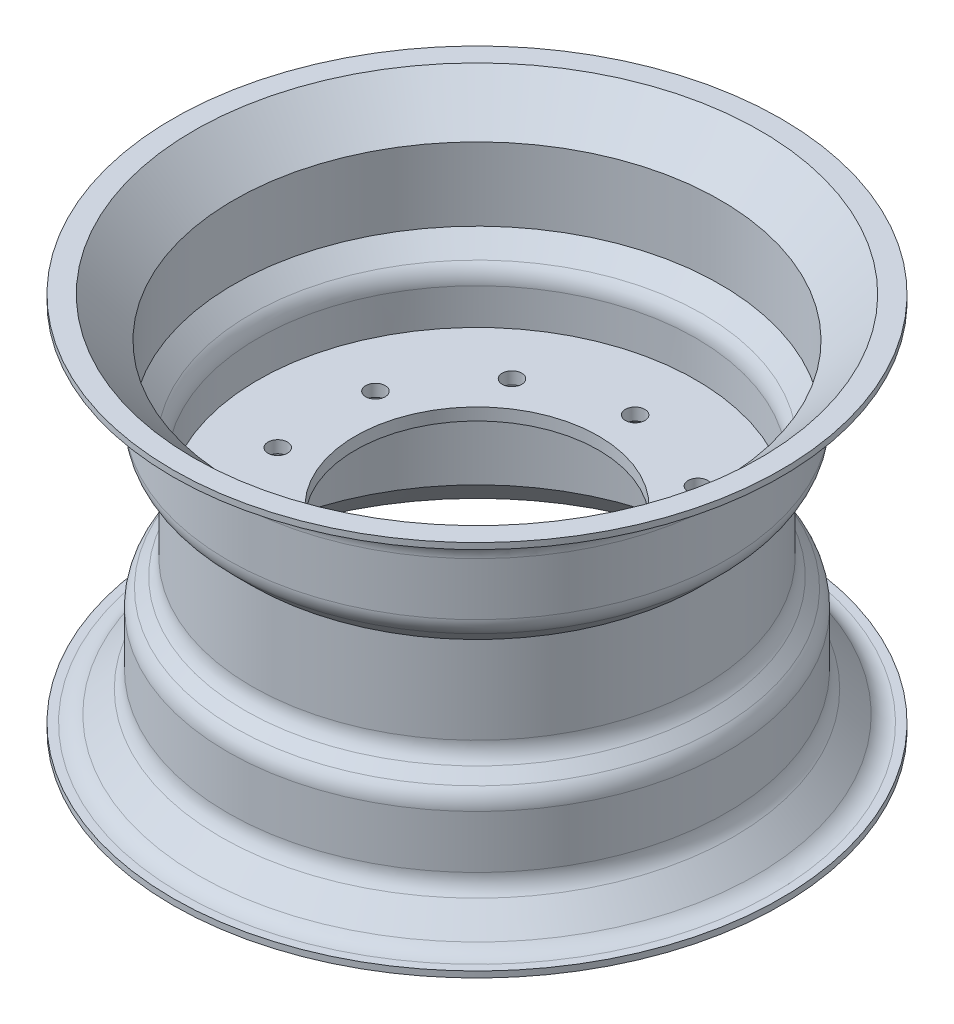
ISO-10303-21;
HEADER;
FILE_DESCRIPTION(('STEP AP214'),'2;1');
FILE_NAME('part.step','',(''),(''),'','','');
FILE_SCHEMA(('AUTOMOTIVE_DESIGN { 1 0 10303 214 1 1 1 1 }'));
ENDSEC;
DATA;
#1=APPLICATION_CONTEXT('core data for automotive mechanical design processes');
#2=APPLICATION_PROTOCOL_DEFINITION('international standard','automotive_design',2000,#1);
#3=PRODUCT_CONTEXT('',#1,'mechanical');
#4=PRODUCT('Part','Part','',(#3));
#5=PRODUCT_RELATED_PRODUCT_CATEGORY('part','',(#4));
#6=PRODUCT_DEFINITION_FORMATION('','',#4);
#7=PRODUCT_DEFINITION_CONTEXT('part definition',#1,'design');
#8=PRODUCT_DEFINITION('design','',#6,#7);
#9=PRODUCT_DEFINITION_SHAPE('','',#8);
#10=(LENGTH_UNIT() NAMED_UNIT(*) SI_UNIT(.MILLI.,.METRE.));
#11=(NAMED_UNIT(*) PLANE_ANGLE_UNIT() SI_UNIT($,.RADIAN.));
#12=(NAMED_UNIT(*) SI_UNIT($,.STERADIAN.) SOLID_ANGLE_UNIT());
#13=UNCERTAINTY_MEASURE_WITH_UNIT(LENGTH_MEASURE(1.E-05),#10,'distance_accuracy_value','');
#14=(GEOMETRIC_REPRESENTATION_CONTEXT(3) GLOBAL_UNCERTAINTY_ASSIGNED_CONTEXT((#13)) GLOBAL_UNIT_ASSIGNED_CONTEXT((#10,
#11,#12)) REPRESENTATION_CONTEXT('',''));
#15=CARTESIAN_POINT('',(0.,0.,0.));
#16=DIRECTION('',(0.,0.,1.));
#17=DIRECTION('',(1.,0.,0.));
#18=AXIS2_PLACEMENT_3D('',#15,#16,#17);
#19=CARTESIAN_POINT('',(0.,200.831817599955,0.));
#20=DIRECTION('',(0.,1.,0.));
#21=DIRECTION('',(0.,0.,1.));
#22=AXIS2_PLACEMENT_3D('',#19,#20,#21);
#23=CYLINDRICAL_SURFACE('',#22,205.);
#24=CARTESIAN_POINT('',(0.,68.2842712474619,0.));
#25=DIRECTION('',(0.,-1.,0.));
#26=DIRECTION('',(0.,0.,-1.));
#27=AXIS2_PLACEMENT_3D('',#24,#25,#26);
#28=CIRCLE('',#27,205.);
#29=CARTESIAN_POINT('',(0.,68.2842712474619,-205.));
#30=VERTEX_POINT('',#29);
#31=EDGE_CURVE('E42',#30,#30,#28,.F.);
#32=ORIENTED_EDGE('',*,*,#31,.T.);
#33=EDGE_LOOP('',(#32));
#34=FACE_BOUND('',#33,.T.);
#35=CARTESIAN_POINT('',(0.,111.715728752538,0.));
#36=DIRECTION('',(0.,1.,0.));
#37=DIRECTION('',(0.,0.,1.));
#38=AXIS2_PLACEMENT_3D('',#35,#36,#37);
#39=CIRCLE('',#38,205.);
#40=CARTESIAN_POINT('',(0.,111.715728752538,205.));
#41=VERTEX_POINT('',#40);
#42=EDGE_CURVE('E46',#41,#41,#39,.F.);
#43=ORIENTED_EDGE('',*,*,#42,.T.);
#44=EDGE_LOOP('',(#43));
#45=FACE_BOUND('',#44,.T.);
#46=ADVANCED_FACE('F35',(#34,#45),#23,.T.);
#47=CARTESIAN_POINT('',(0.,60.,0.));
#48=DIRECTION('',(0.,1.,0.));
#49=DIRECTION('',(0.,0.,1.));
#50=AXIS2_PLACEMENT_3D('',#47,#48,#49);
#51=CONICAL_SURFACE('',#50,205.,0.78539816339745);
#52=CARTESIAN_POINT('',(0.,54.142135623731,0.));
#53=DIRECTION('',(0.,-1.,0.));
#54=DIRECTION('',(0.,0.,-1.));
#55=AXIS2_PLACEMENT_3D('',#52,#53,#54);
#56=CIRCLE('',#55,199.142135623731);
#57=CARTESIAN_POINT('',(0.,54.142135623731,-199.142135623731));
#58=VERTEX_POINT('',#57);
#59=EDGE_CURVE('E10',#58,#58,#56,.T.);
#60=ORIENTED_EDGE('',*,*,#59,.T.);
#61=EDGE_LOOP('',(#60));
#62=FACE_BOUND('',#61,.T.);
#63=CARTESIAN_POINT('',(0.,40.,0.));
#64=DIRECTION('',(0.,1.,0.));
#65=DIRECTION('',(0.,0.,1.));
#66=AXIS2_PLACEMENT_3D('',#63,#64,#65);
#67=CIRCLE('',#66,185.);
#68=CARTESIAN_POINT('',(0.,40.,185.));
#69=VERTEX_POINT('',#68);
#70=EDGE_CURVE('E91',#69,#69,#67,.T.);
#71=ORIENTED_EDGE('',*,*,#70,.T.);
#72=EDGE_LOOP('',(#71));
#73=FACE_BOUND('',#72,.T.);
#74=ADVANCED_FACE('F277',(#62,#73),#51,.T.);
#75=CARTESIAN_POINT('',(0.,200.831817599955,0.));
#76=DIRECTION('',(0.,1.,0.));
#77=DIRECTION('',(0.,0.,1.));
#78=AXIS2_PLACEMENT_3D('',#75,#76,#77);
#79=CYLINDRICAL_SURFACE('',#78,185.);
#80=CARTESIAN_POINT('',(0.,-31.7157287525381,0.));
#81=DIRECTION('',(0.,1.,0.));
#82=DIRECTION('',(0.,0.,1.));
#83=AXIS2_PLACEMENT_3D('',#80,#81,#82);
#84=CIRCLE('',#83,185.);
#85=CARTESIAN_POINT('',(0.,-31.7157287525381,185.));
#86=VERTEX_POINT('',#85);
#87=EDGE_CURVE('E50',#86,#86,#84,.T.);
#88=ORIENTED_EDGE('',*,*,#87,.T.);
#89=EDGE_LOOP('',(#88));
#90=FACE_BOUND('',#89,.T.);
#91=ORIENTED_EDGE('',*,*,#70,.F.);
#92=EDGE_LOOP('',(#91));
#93=FACE_BOUND('',#92,.T.);
#94=ADVANCED_FACE('F282',(#90,#93),#79,.T.);
#95=CARTESIAN_POINT('',(0.,-40.,0.));
#96=DIRECTION('',(0.,-1.,0.));
#97=DIRECTION('',(0.,0.,-1.));
#98=AXIS2_PLACEMENT_3D('',#95,#96,#97);
#99=CONICAL_SURFACE('',#98,185.,0.78539816339745);
#100=CARTESIAN_POINT('',(0.,-54.142135623731,0.));
#101=DIRECTION('',(0.,1.,0.));
#102=DIRECTION('',(0.,0.,1.));
#103=AXIS2_PLACEMENT_3D('',#100,#101,#102);
#104=CIRCLE('',#103,199.142135623731);
#105=CARTESIAN_POINT('',(0.,-54.142135623731,199.142135623731));
#106=VERTEX_POINT('',#105);
#107=EDGE_CURVE('E55',#106,#106,#104,.T.);
#108=ORIENTED_EDGE('',*,*,#107,.T.);
#109=EDGE_LOOP('',(#108));
#110=FACE_BOUND('',#109,.T.);
#111=CARTESIAN_POINT('',(0.,-45.857864376269,0.));
#112=DIRECTION('',(0.,-1.,0.));
#113=DIRECTION('',(0.,0.,-1.));
#114=AXIS2_PLACEMENT_3D('',#111,#112,#113);
#115=CIRCLE('',#114,190.857864376269);
#116=CARTESIAN_POINT('',(0.,-45.857864376269,-190.857864376269));
#117=VERTEX_POINT('',#116);
#118=EDGE_CURVE('E58',#117,#117,#115,.T.);
#119=ORIENTED_EDGE('',*,*,#118,.T.);
#120=EDGE_LOOP('',(#119));
#121=FACE_BOUND('',#120,.T.);
#122=ADVANCED_FACE('F675',(#110,#121),#99,.T.);
#123=CARTESIAN_POINT('',(0.,200.831817599955,0.));
#124=DIRECTION('',(0.,1.,0.));
#125=DIRECTION('',(0.,0.,1.));
#126=AXIS2_PLACEMENT_3D('',#123,#124,#125);
#127=CYLINDRICAL_SURFACE('',#126,205.);
#128=CARTESIAN_POINT('',(0.,-111.715728752538,0.));
#129=DIRECTION('',(0.,1.,0.));
#130=DIRECTION('',(0.,0.,1.));
#131=AXIS2_PLACEMENT_3D('',#128,#129,#130);
#132=CIRCLE('',#131,205.);
#133=CARTESIAN_POINT('',(0.,-111.715728752538,205.));
#134=VERTEX_POINT('',#133);
#135=EDGE_CURVE('E61',#134,#134,#132,.T.);
#136=ORIENTED_EDGE('',*,*,#135,.T.);
#137=EDGE_LOOP('',(#136));
#138=FACE_BOUND('',#137,.T.);
#139=CARTESIAN_POINT('',(0.,-68.2842712474619,0.));
#140=DIRECTION('',(0.,-1.,0.));
#141=DIRECTION('',(0.,0.,-1.));
#142=AXIS2_PLACEMENT_3D('',#139,#140,#141);
#143=CIRCLE('',#142,205.);
#144=CARTESIAN_POINT('',(0.,-68.2842712474619,-205.));
#145=VERTEX_POINT('',#144);
#146=EDGE_CURVE('E64',#145,#145,#143,.T.);
#147=ORIENTED_EDGE('',*,*,#146,.T.);
#148=EDGE_LOOP('',(#147));
#149=FACE_BOUND('',#148,.T.);
#150=ADVANCED_FACE('F273',(#138,#149),#127,.T.);
#151=CARTESIAN_POINT('',(0.,-120.,0.));
#152=DIRECTION('',(0.,-1.,0.));
#153=DIRECTION('',(0.,0.,-1.));
#154=AXIS2_PLACEMENT_3D('',#151,#152,#153);
#155=CONICAL_SURFACE('',#154,205.,0.785398163397452);
#156=CARTESIAN_POINT('',(0.,-144.142135623731,0.));
#157=DIRECTION('',(0.,-1.,0.));
#158=DIRECTION('',(0.,0.,-1.));
#159=AXIS2_PLACEMENT_3D('',#156,#157,#158);
#160=CIRCLE('',#159,229.142135623731);
#161=CARTESIAN_POINT('',(0.,-144.142135623731,-229.142135623731));
#162=VERTEX_POINT('',#161);
#163=EDGE_CURVE('E76',#162,#162,#160,.F.);
#164=ORIENTED_EDGE('',*,*,#163,.T.);
#165=EDGE_LOOP('',(#164));
#166=FACE_BOUND('',#165,.T.);
#167=CARTESIAN_POINT('',(0.,-125.857864376269,0.));
#168=DIRECTION('',(0.,-1.,0.));
#169=DIRECTION('',(0.,0.,-1.));
#170=AXIS2_PLACEMENT_3D('',#167,#168,#169);
#171=CIRCLE('',#170,210.857864376269);
#172=CARTESIAN_POINT('',(0.,-125.857864376269,-210.857864376269));
#173=VERTEX_POINT('',#172);
#174=EDGE_CURVE('E79',#173,#173,#171,.T.);
#175=ORIENTED_EDGE('',*,*,#174,.T.);
#176=EDGE_LOOP('',(#175));
#177=FACE_BOUND('',#176,.T.);
#178=ADVANCED_FACE('F267',(#166,#177),#155,.T.);
#179=CARTESIAN_POINT('',(-250.,-150.,0.));
#180=DIRECTION('',(0.,1.,0.));
#181=DIRECTION('',(0.,0.,1.));
#182=AXIS2_PLACEMENT_3D('',#179,#180,#181);
#183=PLANE('',#182);
#184=CARTESIAN_POINT('',(0.,-150.,0.));
#185=DIRECTION('',(0.,1.,0.));
#186=DIRECTION('',(0.,0.,1.));
#187=AXIS2_PLACEMENT_3D('',#184,#185,#186);
#188=CIRCLE('',#187,243.284271247462);
#189=CARTESIAN_POINT('',(0.,-150.,243.284271247462));
#190=VERTEX_POINT('',#189);
#191=EDGE_CURVE('E73',#190,#190,#188,.F.);
#192=ORIENTED_EDGE('',*,*,#191,.T.);
#193=EDGE_LOOP('',(#192));
#194=FACE_BOUND('',#193,.T.);
#195=CARTESIAN_POINT('',(0.,-150.,0.));
#196=DIRECTION('',(0.,1.,0.));
#197=DIRECTION('',(0.,0.,1.));
#198=AXIS2_PLACEMENT_3D('',#195,#196,#197);
#199=CIRCLE('',#198,250.);
#200=CARTESIAN_POINT('',(0.,-150.,250.));
#201=VERTEX_POINT('',#200);
#202=EDGE_CURVE('E94',#201,#201,#199,.T.);
#203=ORIENTED_EDGE('',*,*,#202,.T.);
#204=EDGE_LOOP('',(#203));
#205=FACE_BOUND('',#204,.T.);
#206=ADVANCED_FACE('F262',(#194,#205),#183,.T.);
#207=CARTESIAN_POINT('',(0.,200.831817599955,0.));
#208=DIRECTION('',(0.,1.,0.));
#209=DIRECTION('',(0.,0.,1.));
#210=AXIS2_PLACEMENT_3D('',#207,#208,#209);
#211=CYLINDRICAL_SURFACE('',#210,250.);
#212=CARTESIAN_POINT('',(0.,-155.,0.));
#213=DIRECTION('',(0.,1.,0.));
#214=DIRECTION('',(0.,0.,1.));
#215=AXIS2_PLACEMENT_3D('',#212,#213,#214);
#216=CIRCLE('',#215,250.);
#217=CARTESIAN_POINT('',(0.,-155.,250.));
#218=VERTEX_POINT('',#217);
#219=EDGE_CURVE('E97',#218,#218,#216,.T.);
#220=ORIENTED_EDGE('',*,*,#219,.T.);
#221=EDGE_LOOP('',(#220));
#222=FACE_BOUND('',#221,.T.);
#223=ORIENTED_EDGE('',*,*,#202,.F.);
#224=EDGE_LOOP('',(#223));
#225=FACE_BOUND('',#224,.T.);
#226=ADVANCED_FACE('F256',(#222,#225),#211,.T.);
#227=CARTESIAN_POINT('',(-250.,-155.,0.));
#228=DIRECTION('',(0.,-1.,0.));
#229=DIRECTION('',(0.,0.,-1.));
#230=AXIS2_PLACEMENT_3D('',#227,#228,#229);
#231=PLANE('',#230);
#232=CARTESIAN_POINT('',(0.,-155.,0.));
#233=DIRECTION('',(0.,1.,0.));
#234=DIRECTION('',(0.,0.,1.));
#235=AXIS2_PLACEMENT_3D('',#232,#233,#234);
#236=CIRCLE('',#235,232.928932188135);
#237=CARTESIAN_POINT('',(0.,-155.,232.928932188135));
#238=VERTEX_POINT('',#237);
#239=EDGE_CURVE('E100',#238,#238,#236,.T.);
#240=ORIENTED_EDGE('',*,*,#239,.T.);
#241=EDGE_LOOP('',(#240));
#242=FACE_BOUND('',#241,.T.);
#243=ORIENTED_EDGE('',*,*,#219,.F.);
#244=EDGE_LOOP('',(#243));
#245=FACE_BOUND('',#244,.T.);
#246=ADVANCED_FACE('F250',(#242,#245),#231,.T.);
#247=CARTESIAN_POINT('',(0.,-155.,0.));
#248=DIRECTION('',(0.,-1.,0.));
#249=DIRECTION('',(0.,0.,-1.));
#250=AXIS2_PLACEMENT_3D('',#247,#248,#249);
#251=CONICAL_SURFACE('',#250,232.928932188135,0.785398163397448);
#252=CARTESIAN_POINT('',(0.,-122.071067811865,0.));
#253=DIRECTION('',(0.,1.,0.));
#254=DIRECTION('',(0.,0.,1.));
#255=AXIS2_PLACEMENT_3D('',#252,#253,#254);
#256=CIRCLE('',#255,200.);
#257=CARTESIAN_POINT('',(0.,-122.071067811865,200.));
#258=VERTEX_POINT('',#257);
#259=EDGE_CURVE('E103',#258,#258,#256,.T.);
#260=ORIENTED_EDGE('',*,*,#259,.T.);
#261=EDGE_LOOP('',(#260));
#262=FACE_BOUND('',#261,.T.);
#263=ORIENTED_EDGE('',*,*,#239,.F.);
#264=EDGE_LOOP('',(#263));
#265=FACE_BOUND('',#264,.T.);
#266=ADVANCED_FACE('F244',(#262,#265),#251,.F.);
#267=CARTESIAN_POINT('',(0.,200.831817599955,0.));
#268=DIRECTION('',(0.,1.,0.));
#269=DIRECTION('',(0.,0.,1.));
#270=AXIS2_PLACEMENT_3D('',#267,#268,#269);
#271=CYLINDRICAL_SURFACE('',#270,200.);
#272=CARTESIAN_POINT('',(0.,-62.0710678118655,0.));
#273=DIRECTION('',(0.,1.,0.));
#274=DIRECTION('',(0.,0.,1.));
#275=AXIS2_PLACEMENT_3D('',#272,#273,#274);
#276=CIRCLE('',#275,200.);
#277=CARTESIAN_POINT('',(0.,-62.0710678118655,200.));
#278=VERTEX_POINT('',#277);
#279=EDGE_CURVE('E106',#278,#278,#276,.T.);
#280=ORIENTED_EDGE('',*,*,#279,.T.);
#281=EDGE_LOOP('',(#280));
#282=FACE_BOUND('',#281,.T.);
#283=ORIENTED_EDGE('',*,*,#259,.F.);
#284=EDGE_LOOP('',(#283));
#285=FACE_BOUND('',#284,.T.);
#286=ADVANCED_FACE('F238',(#282,#285),#271,.F.);
#287=CARTESIAN_POINT('',(0.,-62.0710678118655,0.));
#288=DIRECTION('',(0.,-1.,0.));
#289=DIRECTION('',(0.,0.,-1.));
#290=AXIS2_PLACEMENT_3D('',#287,#288,#289);
#291=CONICAL_SURFACE('',#290,200.,0.785398163397448);
#292=CARTESIAN_POINT('',(0.,-42.0710678118654,0.));
#293=DIRECTION('',(0.,1.,0.));
#294=DIRECTION('',(0.,0.,1.));
#295=AXIS2_PLACEMENT_3D('',#292,#293,#294);
#296=CIRCLE('',#295,180.);
#297=CARTESIAN_POINT('',(0.,-42.0710678118654,180.));
#298=VERTEX_POINT('',#297);
#299=EDGE_CURVE('E109',#298,#298,#296,.T.);
#300=ORIENTED_EDGE('',*,*,#299,.T.);
#301=EDGE_LOOP('',(#300));
#302=FACE_BOUND('',#301,.T.);
#303=ORIENTED_EDGE('',*,*,#279,.F.);
#304=EDGE_LOOP('',(#303));
#305=FACE_BOUND('',#304,.T.);
#306=ADVANCED_FACE('F232',(#302,#305),#291,.F.);
#307=CARTESIAN_POINT('',(0.,200.831817599955,0.));
#308=DIRECTION('',(0.,1.,0.));
#309=DIRECTION('',(0.,0.,1.));
#310=AXIS2_PLACEMENT_3D('',#307,#308,#309);
#311=CYLINDRICAL_SURFACE('',#310,180.);
#312=CARTESIAN_POINT('',(0.,-5.89768013700667,0.));
#313=DIRECTION('',(0.,1.,0.));
#314=DIRECTION('',(0.,0.,1.));
#315=AXIS2_PLACEMENT_3D('',#312,#313,#314);
#316=CIRCLE('',#315,180.);
#317=CARTESIAN_POINT('',(0.,-5.89768013700667,180.));
#318=VERTEX_POINT('',#317);
#319=EDGE_CURVE('E112',#318,#318,#316,.T.);
#320=ORIENTED_EDGE('',*,*,#319,.T.);
#321=EDGE_LOOP('',(#320));
#322=FACE_BOUND('',#321,.T.);
#323=ORIENTED_EDGE('',*,*,#299,.F.);
#324=EDGE_LOOP('',(#323));
#325=FACE_BOUND('',#324,.T.);
#326=ADVANCED_FACE('F225',(#322,#325),#311,.F.);
#327=CARTESIAN_POINT('',(-180.,-5.89768013700667,0.));
#328=DIRECTION('',(0.,-1.,0.));
#329=DIRECTION('',(0.,0.,-1.));
#330=AXIS2_PLACEMENT_3D('',#327,#328,#329);
#331=PLANE('',#330);
#332=CARTESIAN_POINT('',(76.4120827980201,-5.89768013700667,-105.172209268744));
#333=DIRECTION('',(0.,-1.,0.));
#334=DIRECTION('',(0.,0.,-1.));
#335=AXIS2_PLACEMENT_3D('',#332,#333,#334);
#336=CIRCLE('',#335,8.);
#337=CARTESIAN_POINT('',(76.4120827980201,-5.89768013700667,-113.172209268744));
#338=VERTEX_POINT('',#337);
#339=EDGE_CURVE('E145',#338,#338,#336,.T.);
#340=ORIENTED_EDGE('',*,*,#339,.F.);
#341=EDGE_LOOP('',(#340));
#342=FACE_BOUND('',#341,.T.);
#343=CARTESIAN_POINT('',(123.63734711837,-5.89768013700667,-40.1722092687445));
#344=DIRECTION('',(0.,-1.,0.));
#345=DIRECTION('',(0.,0.,-1.));
#346=AXIS2_PLACEMENT_3D('',#343,#344,#345);
#347=CIRCLE('',#346,8.);
#348=CARTESIAN_POINT('',(123.63734711837,-5.89768013700667,-48.1722092687445));
#349=VERTEX_POINT('',#348);
#350=EDGE_CURVE('E148',#349,#349,#347,.T.);
#351=ORIENTED_EDGE('',*,*,#350,.F.);
#352=EDGE_LOOP('',(#351));
#353=FACE_BOUND('',#352,.T.);
#354=CARTESIAN_POINT('',(123.63734711837,-5.89768013700667,40.172209268742));
#355=DIRECTION('',(0.,-1.,0.));
#356=DIRECTION('',(0.,0.,-1.));
#357=AXIS2_PLACEMENT_3D('',#354,#355,#356);
#358=CIRCLE('',#357,8.);
#359=CARTESIAN_POINT('',(123.63734711837,-5.89768013700667,32.172209268742));
#360=VERTEX_POINT('',#359);
#361=EDGE_CURVE('E151',#360,#360,#358,.T.);
#362=ORIENTED_EDGE('',*,*,#361,.F.);
#363=EDGE_LOOP('',(#362));
#364=FACE_BOUND('',#363,.T.);
#365=CARTESIAN_POINT('',(76.4120827980224,-5.89768013700667,105.172209268743));
#366=DIRECTION('',(0.,-1.,0.));
#367=DIRECTION('',(0.,0.,-1.));
#368=AXIS2_PLACEMENT_3D('',#365,#366,#367);
#369=CIRCLE('',#368,8.);
#370=CARTESIAN_POINT('',(76.4120827980224,-5.89768013700667,97.1722092687425));
#371=VERTEX_POINT('',#370);
#372=EDGE_CURVE('E154',#371,#371,#369,.T.);
#373=ORIENTED_EDGE('',*,*,#372,.F.);
#374=EDGE_LOOP('',(#373));
#375=FACE_BOUND('',#374,.T.);
#376=CARTESIAN_POINT('',(0.,-5.89768013700667,130.));
#377=DIRECTION('',(0.,-1.,0.));
#378=DIRECTION('',(0.,0.,-1.));
#379=AXIS2_PLACEMENT_3D('',#376,#377,#378);
#380=CIRCLE('',#379,8.);
#381=CARTESIAN_POINT('',(0.,-5.89768013700667,122.));
#382=VERTEX_POINT('',#381);
#383=EDGE_CURVE('E157',#382,#382,#380,.T.);
#384=ORIENTED_EDGE('',*,*,#383,.F.);
#385=EDGE_LOOP('',(#384));
#386=FACE_BOUND('',#385,.T.);
#387=CARTESIAN_POINT('',(-76.4120827980209,-5.89768013700667,105.172209268744));
#388=DIRECTION('',(0.,-1.,0.));
#389=DIRECTION('',(0.,0.,-1.));
#390=AXIS2_PLACEMENT_3D('',#387,#388,#389);
#391=CIRCLE('',#390,8.);
#392=CARTESIAN_POINT('',(-76.4120827980209,-5.89768013700667,97.1722092687436));
#393=VERTEX_POINT('',#392);
#394=EDGE_CURVE('E160',#393,#393,#391,.T.);
#395=ORIENTED_EDGE('',*,*,#394,.F.);
#396=EDGE_LOOP('',(#395));
#397=FACE_BOUND('',#396,.T.);
#398=CARTESIAN_POINT('',(-123.63734711837,-5.89768013700667,40.1722092687437));
#399=DIRECTION('',(0.,-1.,0.));
#400=DIRECTION('',(0.,0.,-1.));
#401=AXIS2_PLACEMENT_3D('',#398,#399,#400);
#402=CIRCLE('',#401,8.);
#403=CARTESIAN_POINT('',(-123.63734711837,-5.89768013700667,32.1722092687437));
#404=VERTEX_POINT('',#403);
#405=EDGE_CURVE('E163',#404,#404,#402,.T.);
#406=ORIENTED_EDGE('',*,*,#405,.F.);
#407=EDGE_LOOP('',(#406));
#408=FACE_BOUND('',#407,.T.);
#409=CARTESIAN_POINT('',(-123.63734711837,-5.89768013700667,-40.1722092687428));
#410=DIRECTION('',(0.,-1.,0.));
#411=DIRECTION('',(0.,0.,-1.));
#412=AXIS2_PLACEMENT_3D('',#409,#410,#411);
#413=CIRCLE('',#412,8.);
#414=CARTESIAN_POINT('',(-123.63734711837,-5.89768013700667,-48.1722092687428));
#415=VERTEX_POINT('',#414);
#416=EDGE_CURVE('E166',#415,#415,#413,.T.);
#417=ORIENTED_EDGE('',*,*,#416,.F.);
#418=EDGE_LOOP('',(#417));
#419=FACE_BOUND('',#418,.T.);
#420=CARTESIAN_POINT('',(-76.4120827980217,-5.89768013700667,-105.172209268743));
#421=DIRECTION('',(0.,-1.,0.));
#422=DIRECTION('',(0.,0.,-1.));
#423=AXIS2_PLACEMENT_3D('',#420,#421,#422);
#424=CIRCLE('',#423,8.);
#425=CARTESIAN_POINT('',(-76.4120827980217,-5.89768013700667,-113.172209268743));
#426=VERTEX_POINT('',#425);
#427=EDGE_CURVE('E169',#426,#426,#424,.T.);
#428=ORIENTED_EDGE('',*,*,#427,.F.);
#429=EDGE_LOOP('',(#428));
#430=FACE_BOUND('',#429,.T.);
#431=CARTESIAN_POINT('',(0.,-5.89768013700667,-130.));
#432=DIRECTION('',(0.,-1.,0.));
#433=DIRECTION('',(0.,0.,-1.));
#434=AXIS2_PLACEMENT_3D('',#431,#432,#433);
#435=CIRCLE('',#434,8.);
#436=CARTESIAN_POINT('',(0.,-5.89768013700667,-138.));
#437=VERTEX_POINT('',#436);
#438=EDGE_CURVE('E139',#437,#437,#435,.T.);
#439=ORIENTED_EDGE('',*,*,#438,.F.);
#440=EDGE_LOOP('',(#439));
#441=FACE_BOUND('',#440,.T.);
#442=CARTESIAN_POINT('',(0.,-5.89768013700667,0.));
#443=DIRECTION('',(0.,1.,0.));
#444=DIRECTION('',(0.,0.,1.));
#445=AXIS2_PLACEMENT_3D('',#442,#443,#444);
#446=CIRCLE('',#445,100.);
#447=CARTESIAN_POINT('',(0.,-5.89768013700667,100.));
#448=VERTEX_POINT('',#447);
#449=EDGE_CURVE('E115',#448,#448,#446,.T.);
#450=ORIENTED_EDGE('',*,*,#449,.T.);
#451=EDGE_LOOP('',(#450));
#452=FACE_BOUND('',#451,.T.);
#453=ORIENTED_EDGE('',*,*,#319,.F.);
#454=EDGE_LOOP('',(#453));
#455=FACE_BOUND('',#454,.T.);
#456=ADVANCED_FACE('F219',(#342,#353,#364,#375,#386,#397,#408,#419,#430,#441,#452,#455),#331,.T.);
#457=CARTESIAN_POINT('',(0.,200.831817599955,0.));
#458=DIRECTION('',(0.,1.,0.));
#459=DIRECTION('',(0.,0.,1.));
#460=AXIS2_PLACEMENT_3D('',#457,#458,#459);
#461=CYLINDRICAL_SURFACE('',#460,100.);
#462=CARTESIAN_POINT('',(0.,4.10231986299334,0.));
#463=DIRECTION('',(0.,1.,0.));
#464=DIRECTION('',(0.,0.,1.));
#465=AXIS2_PLACEMENT_3D('',#462,#463,#464);
#466=CIRCLE('',#465,100.);
#467=CARTESIAN_POINT('',(0.,4.10231986299334,100.));
#468=VERTEX_POINT('',#467);
#469=EDGE_CURVE('E118',#468,#468,#466,.T.);
#470=ORIENTED_EDGE('',*,*,#469,.T.);
#471=EDGE_LOOP('',(#470));
#472=FACE_BOUND('',#471,.T.);
#473=ORIENTED_EDGE('',*,*,#449,.F.);
#474=EDGE_LOOP('',(#473));
#475=FACE_BOUND('',#474,.T.);
#476=ADVANCED_FACE('F206',(#472,#475),#461,.F.);
#477=CARTESIAN_POINT('',(-180.,4.10231986299333,0.));
#478=DIRECTION('',(0.,1.,0.));
#479=DIRECTION('',(0.,0.,1.));
#480=AXIS2_PLACEMENT_3D('',#477,#478,#479);
#481=PLANE('',#480);
#482=CARTESIAN_POINT('',(76.4120827980201,4.10231986299333,-105.172209268744));
#483=DIRECTION('',(0.,1.,0.));
#484=DIRECTION('',(-0.587785252292462,0.,0.809016994374955));
#485=AXIS2_PLACEMENT_3D('',#482,#483,#484);
#486=CIRCLE('',#485,8.);
#487=CARTESIAN_POINT('',(71.7098007796804,4.10231986299333,-98.7000733137445));
#488=VERTEX_POINT('',#487);
#489=EDGE_CURVE('E176',#488,#488,#486,.T.);
#490=ORIENTED_EDGE('',*,*,#489,.F.);
#491=EDGE_LOOP('',(#490));
#492=FACE_BOUND('',#491,.T.);
#493=CARTESIAN_POINT('',(123.63734711837,4.10231986299333,-40.1722092687445));
#494=DIRECTION('',(0.,1.,0.));
#495=DIRECTION('',(-0.95105651629515,0.,0.309016994374958));
#496=AXIS2_PLACEMENT_3D('',#493,#494,#495);
#497=CIRCLE('',#496,8.);
#498=CARTESIAN_POINT('',(116.028894988008,4.10231986299333,-37.7000733137449));
#499=VERTEX_POINT('',#498);
#500=EDGE_CURVE('E179',#499,#499,#497,.T.);
#501=ORIENTED_EDGE('',*,*,#500,.F.);
#502=EDGE_LOOP('',(#501));
#503=FACE_BOUND('',#502,.T.);
#504=CARTESIAN_POINT('',(123.63734711837,4.10231986299333,40.172209268742));
#505=DIRECTION('',(0.,1.,0.));
#506=DIRECTION('',(-0.951056516295157,0.,-0.309016994374938));
#507=AXIS2_PLACEMENT_3D('',#504,#505,#506);
#508=CIRCLE('',#507,8.);
#509=CARTESIAN_POINT('',(116.028894988009,4.10231986299333,37.7000733137425));
#510=VERTEX_POINT('',#509);
#511=EDGE_CURVE('E182',#510,#510,#508,.T.);
#512=ORIENTED_EDGE('',*,*,#511,.F.);
#513=EDGE_LOOP('',(#512));
#514=FACE_BOUND('',#513,.T.);
#515=CARTESIAN_POINT('',(76.4120827980224,4.10231986299333,105.172209268743));
#516=DIRECTION('',(0.,1.,0.));
#517=DIRECTION('',(-0.58778525229248,0.,-0.809016994374942));
#518=AXIS2_PLACEMENT_3D('',#515,#516,#517);
#519=CIRCLE('',#518,8.);
#520=CARTESIAN_POINT('',(71.7098007796826,4.10231986299333,98.700073313743));
#521=VERTEX_POINT('',#520);
#522=EDGE_CURVE('E185',#521,#521,#519,.T.);
#523=ORIENTED_EDGE('',*,*,#522,.F.);
#524=EDGE_LOOP('',(#523));
#525=FACE_BOUND('',#524,.T.);
#526=CARTESIAN_POINT('',(0.,4.10231986299333,130.));
#527=DIRECTION('',(0.,1.,0.));
#528=DIRECTION('',(0.,0.,-1.));
#529=AXIS2_PLACEMENT_3D('',#526,#527,#528);
#530=CIRCLE('',#529,8.);
#531=CARTESIAN_POINT('',(0.,4.10231986299333,122.));
#532=VERTEX_POINT('',#531);
#533=EDGE_CURVE('E188',#532,#532,#530,.T.);
#534=ORIENTED_EDGE('',*,*,#533,.F.);
#535=EDGE_LOOP('',(#534));
#536=FACE_BOUND('',#535,.T.);
#537=CARTESIAN_POINT('',(-76.4120827980209,4.10231986299333,105.172209268744));
#538=DIRECTION('',(0.,1.,0.));
#539=DIRECTION('',(0.587785252292469,0.,-0.809016994374951));
#540=AXIS2_PLACEMENT_3D('',#537,#538,#539);
#541=CIRCLE('',#540,8.);
#542=CARTESIAN_POINT('',(-71.7098007796812,4.10231986299333,98.700073313744));
#543=VERTEX_POINT('',#542);
#544=EDGE_CURVE('E191',#543,#543,#541,.T.);
#545=ORIENTED_EDGE('',*,*,#544,.F.);
#546=EDGE_LOOP('',(#545));
#547=FACE_BOUND('',#546,.T.);
#548=CARTESIAN_POINT('',(-123.63734711837,4.10231986299333,40.1722092687437));
#549=DIRECTION('',(0.,1.,0.));
#550=DIRECTION('',(0.951056516295152,0.,-0.309016994374952));
#551=AXIS2_PLACEMENT_3D('',#548,#549,#550);
#552=CIRCLE('',#551,8.);
#553=CARTESIAN_POINT('',(-116.028894988009,4.10231986299333,37.7000733137441));
#554=VERTEX_POINT('',#553);
#555=EDGE_CURVE('E194',#554,#554,#552,.T.);
#556=ORIENTED_EDGE('',*,*,#555,.F.);
#557=EDGE_LOOP('',(#556));
#558=FACE_BOUND('',#557,.T.);
#559=CARTESIAN_POINT('',(-123.63734711837,4.10231986299333,-40.1722092687428));
#560=DIRECTION('',(0.,1.,0.));
#561=DIRECTION('',(0.951056516295155,0.,0.309016994374945));
#562=AXIS2_PLACEMENT_3D('',#559,#560,#561);
#563=CIRCLE('',#562,8.);
#564=CARTESIAN_POINT('',(-116.028894988009,4.10231986299333,-37.7000733137433));
#565=VERTEX_POINT('',#564);
#566=EDGE_CURVE('E175',#565,#565,#563,.T.);
#567=ORIENTED_EDGE('',*,*,#566,.F.);
#568=EDGE_LOOP('',(#567));
#569=FACE_BOUND('',#568,.T.);
#570=CARTESIAN_POINT('',(-76.4120827980217,4.10231986299333,-105.172209268743));
#571=DIRECTION('',(0.,1.,0.));
#572=DIRECTION('',(0.587785252292474,0.,0.809016994374947));
#573=AXIS2_PLACEMENT_3D('',#570,#571,#572);
#574=CIRCLE('',#573,8.);
#575=CARTESIAN_POINT('',(-71.7098007796819,4.10231986299333,-98.7000733137435));
#576=VERTEX_POINT('',#575);
#577=EDGE_CURVE('E172',#576,#576,#574,.T.);
#578=ORIENTED_EDGE('',*,*,#577,.F.);
#579=EDGE_LOOP('',(#578));
#580=FACE_BOUND('',#579,.T.);
#581=CARTESIAN_POINT('',(0.,4.10231986299333,-130.));
#582=DIRECTION('',(0.,1.,0.));
#583=DIRECTION('',(0.,0.,1.));
#584=AXIS2_PLACEMENT_3D('',#581,#582,#583);
#585=CIRCLE('',#584,8.);
#586=CARTESIAN_POINT('',(0.,4.10231986299333,-122.));
#587=VERTEX_POINT('',#586);
#588=EDGE_CURVE('E142',#587,#587,#585,.T.);
#589=ORIENTED_EDGE('',*,*,#588,.F.);
#590=EDGE_LOOP('',(#589));
#591=FACE_BOUND('',#590,.T.);
#592=CARTESIAN_POINT('',(0.,4.10231986299334,0.));
#593=DIRECTION('',(0.,1.,0.));
#594=DIRECTION('',(0.,0.,1.));
#595=AXIS2_PLACEMENT_3D('',#592,#593,#594);
#596=CIRCLE('',#595,180.);
#597=CARTESIAN_POINT('',(0.,4.10231986299334,180.));
#598=VERTEX_POINT('',#597);
#599=EDGE_CURVE('E121',#598,#598,#596,.T.);
#600=ORIENTED_EDGE('',*,*,#599,.T.);
#601=EDGE_LOOP('',(#600));
#602=FACE_BOUND('',#601,.T.);
#603=ORIENTED_EDGE('',*,*,#469,.F.);
#604=EDGE_LOOP('',(#603));
#605=FACE_BOUND('',#604,.T.);
#606=ADVANCED_FACE('F202',(#492,#503,#514,#525,#536,#547,#558,#569,#580,#591,#602,#605),#481,.T.);
#607=CARTESIAN_POINT('',(0.,200.831817599955,0.));
#608=DIRECTION('',(0.,1.,0.));
#609=DIRECTION('',(0.,0.,1.));
#610=AXIS2_PLACEMENT_3D('',#607,#608,#609);
#611=CYLINDRICAL_SURFACE('',#610,180.);
#612=CARTESIAN_POINT('',(0.,33.7867965644035,0.));
#613=DIRECTION('',(0.,-1.,0.));
#614=DIRECTION('',(0.,0.,-1.));
#615=AXIS2_PLACEMENT_3D('',#612,#613,#614);
#616=CIRCLE('',#615,180.);
#617=CARTESIAN_POINT('',(0.,33.7867965644035,-180.));
#618=VERTEX_POINT('',#617);
#619=EDGE_CURVE('E70',#618,#618,#616,.F.);
#620=ORIENTED_EDGE('',*,*,#619,.T.);
#621=EDGE_LOOP('',(#620));
#622=FACE_BOUND('',#621,.T.);
#623=ORIENTED_EDGE('',*,*,#599,.F.);
#624=EDGE_LOOP('',(#623));
#625=FACE_BOUND('',#624,.T.);
#626=ADVANCED_FACE('F205',(#622,#625),#611,.F.);
#627=CARTESIAN_POINT('',(0.,42.0710678118654,0.));
#628=DIRECTION('',(0.,1.,0.));
#629=DIRECTION('',(0.,0.,1.));
#630=AXIS2_PLACEMENT_3D('',#627,#628,#629);
#631=CONICAL_SURFACE('',#630,180.,0.785398163397448);
#632=CARTESIAN_POINT('',(0.,47.9289321881344,0.));
#633=DIRECTION('',(0.,-1.,0.));
#634=DIRECTION('',(0.,0.,-1.));
#635=AXIS2_PLACEMENT_3D('',#632,#633,#634);
#636=CIRCLE('',#635,185.857864376269);
#637=CARTESIAN_POINT('',(0.,47.9289321881344,-185.857864376269));
#638=VERTEX_POINT('',#637);
#639=EDGE_CURVE('E67',#638,#638,#636,.T.);
#640=ORIENTED_EDGE('',*,*,#639,.T.);
#641=EDGE_LOOP('',(#640));
#642=FACE_BOUND('',#641,.T.);
#643=CARTESIAN_POINT('',(0.,62.0710678118655,0.));
#644=DIRECTION('',(0.,1.,0.));
#645=DIRECTION('',(0.,0.,1.));
#646=AXIS2_PLACEMENT_3D('',#643,#644,#645);
#647=CIRCLE('',#646,200.);
#648=CARTESIAN_POINT('',(0.,62.0710678118655,200.));
#649=VERTEX_POINT('',#648);
#650=EDGE_CURVE('E124',#649,#649,#647,.T.);
#651=ORIENTED_EDGE('',*,*,#650,.T.);
#652=EDGE_LOOP('',(#651));
#653=FACE_BOUND('',#652,.T.);
#654=ADVANCED_FACE('F356',(#642,#653),#631,.F.);
#655=CARTESIAN_POINT('',(0.,200.831817599955,0.));
#656=DIRECTION('',(0.,1.,0.));
#657=DIRECTION('',(0.,0.,1.));
#658=AXIS2_PLACEMENT_3D('',#655,#656,#657);
#659=CYLINDRICAL_SURFACE('',#658,200.);
#660=CARTESIAN_POINT('',(0.,122.071067811865,0.));
#661=DIRECTION('',(0.,1.,0.));
#662=DIRECTION('',(0.,0.,1.));
#663=AXIS2_PLACEMENT_3D('',#660,#661,#662);
#664=CIRCLE('',#663,200.);
#665=CARTESIAN_POINT('',(0.,122.071067811865,200.));
#666=VERTEX_POINT('',#665);
#667=EDGE_CURVE('E127',#666,#666,#664,.T.);
#668=ORIENTED_EDGE('',*,*,#667,.T.);
#669=EDGE_LOOP('',(#668));
#670=FACE_BOUND('',#669,.T.);
#671=ORIENTED_EDGE('',*,*,#650,.F.);
#672=EDGE_LOOP('',(#671));
#673=FACE_BOUND('',#672,.T.);
#674=ADVANCED_FACE('F352',(#670,#673),#659,.F.);
#675=CARTESIAN_POINT('',(0.,122.071067811865,0.));
#676=DIRECTION('',(0.,1.,0.));
#677=DIRECTION('',(0.,0.,1.));
#678=AXIS2_PLACEMENT_3D('',#675,#676,#677);
#679=CONICAL_SURFACE('',#678,200.,0.785398163397448);
#680=CARTESIAN_POINT('',(0.,155.,0.));
#681=DIRECTION('',(0.,1.,0.));
#682=DIRECTION('',(0.,0.,1.));
#683=AXIS2_PLACEMENT_3D('',#680,#681,#682);
#684=CIRCLE('',#683,232.928932188135);
#685=CARTESIAN_POINT('',(0.,155.,232.928932188135));
#686=VERTEX_POINT('',#685);
#687=EDGE_CURVE('E130',#686,#686,#684,.T.);
#688=ORIENTED_EDGE('',*,*,#687,.T.);
#689=EDGE_LOOP('',(#688));
#690=FACE_BOUND('',#689,.T.);
#691=ORIENTED_EDGE('',*,*,#667,.F.);
#692=EDGE_LOOP('',(#691));
#693=FACE_BOUND('',#692,.T.);
#694=ADVANCED_FACE('F348',(#690,#693),#679,.F.);
#695=CARTESIAN_POINT('',(-250.,155.,0.));
#696=DIRECTION('',(0.,1.,0.));
#697=DIRECTION('',(0.,0.,1.));
#698=AXIS2_PLACEMENT_3D('',#695,#696,#697);
#699=PLANE('',#698);
#700=CARTESIAN_POINT('',(0.,155.,0.));
#701=DIRECTION('',(0.,1.,0.));
#702=DIRECTION('',(0.,0.,1.));
#703=AXIS2_PLACEMENT_3D('',#700,#701,#702);
#704=CIRCLE('',#703,250.);
#705=CARTESIAN_POINT('',(0.,155.,250.));
#706=VERTEX_POINT('',#705);
#707=EDGE_CURVE('E133',#706,#706,#704,.T.);
#708=ORIENTED_EDGE('',*,*,#707,.T.);
#709=EDGE_LOOP('',(#708));
#710=FACE_BOUND('',#709,.T.);
#711=ORIENTED_EDGE('',*,*,#687,.F.);
#712=EDGE_LOOP('',(#711));
#713=FACE_BOUND('',#712,.T.);
#714=ADVANCED_FACE('F344',(#710,#713),#699,.T.);
#715=CARTESIAN_POINT('',(0.,200.831817599955,0.));
#716=DIRECTION('',(0.,1.,0.));
#717=DIRECTION('',(0.,0.,1.));
#718=AXIS2_PLACEMENT_3D('',#715,#716,#717);
#719=CYLINDRICAL_SURFACE('',#718,250.);
#720=CARTESIAN_POINT('',(0.,150.,0.));
#721=DIRECTION('',(0.,1.,0.));
#722=DIRECTION('',(0.,0.,1.));
#723=AXIS2_PLACEMENT_3D('',#720,#721,#722);
#724=CIRCLE('',#723,250.);
#725=CARTESIAN_POINT('',(0.,150.,250.));
#726=VERTEX_POINT('',#725);
#727=EDGE_CURVE('E136',#726,#726,#724,.T.);
#728=ORIENTED_EDGE('',*,*,#727,.T.);
#729=EDGE_LOOP('',(#728));
#730=FACE_BOUND('',#729,.T.);
#731=ORIENTED_EDGE('',*,*,#707,.F.);
#732=EDGE_LOOP('',(#731));
#733=FACE_BOUND('',#732,.T.);
#734=ADVANCED_FACE('F337',(#730,#733),#719,.T.);
#735=CARTESIAN_POINT('',(-250.,150.,0.));
#736=DIRECTION('',(0.,-1.,0.));
#737=DIRECTION('',(0.,0.,-1.));
#738=AXIS2_PLACEMENT_3D('',#735,#736,#737);
#739=PLANE('',#738);
#740=CARTESIAN_POINT('',(0.,150.,0.));
#741=DIRECTION('',(0.,-1.,0.));
#742=DIRECTION('',(0.,0.,-1.));
#743=AXIS2_PLACEMENT_3D('',#740,#741,#742);
#744=CIRCLE('',#743,243.284271247462);
#745=CARTESIAN_POINT('',(0.,150.,-243.284271247462));
#746=VERTEX_POINT('',#745);
#747=EDGE_CURVE('E88',#746,#746,#744,.F.);
#748=ORIENTED_EDGE('',*,*,#747,.T.);
#749=EDGE_LOOP('',(#748));
#750=FACE_BOUND('',#749,.T.);
#751=ORIENTED_EDGE('',*,*,#727,.F.);
#752=EDGE_LOOP('',(#751));
#753=FACE_BOUND('',#752,.T.);
#754=ADVANCED_FACE('F331',(#750,#753),#739,.T.);
#755=CARTESIAN_POINT('',(0.,150.,0.));
#756=DIRECTION('',(0.,1.,0.));
#757=DIRECTION('',(0.,0.,1.));
#758=AXIS2_PLACEMENT_3D('',#755,#756,#757);
#759=CONICAL_SURFACE('',#758,235.,0.785398163397451);
#760=CARTESIAN_POINT('',(0.,144.142135623731,0.));
#761=DIRECTION('',(0.,1.,0.));
#762=DIRECTION('',(0.,0.,1.));
#763=AXIS2_PLACEMENT_3D('',#760,#761,#762);
#764=CIRCLE('',#763,229.142135623731);
#765=CARTESIAN_POINT('',(0.,144.142135623731,229.142135623731));
#766=VERTEX_POINT('',#765);
#767=EDGE_CURVE('E82',#766,#766,#764,.F.);
#768=ORIENTED_EDGE('',*,*,#767,.T.);
#769=EDGE_LOOP('',(#768));
#770=FACE_BOUND('',#769,.T.);
#771=CARTESIAN_POINT('',(0.,125.857864376269,0.));
#772=DIRECTION('',(0.,1.,0.));
#773=DIRECTION('',(0.,0.,1.));
#774=AXIS2_PLACEMENT_3D('',#771,#772,#773);
#775=CIRCLE('',#774,210.857864376269);
#776=CARTESIAN_POINT('',(0.,125.857864376269,210.857864376269));
#777=VERTEX_POINT('',#776);
#778=EDGE_CURVE('E85',#777,#777,#775,.T.);
#779=ORIENTED_EDGE('',*,*,#778,.T.);
#780=EDGE_LOOP('',(#779));
#781=FACE_BOUND('',#780,.T.);
#782=ADVANCED_FACE('F291',(#770,#781),#759,.T.);
#783=CARTESIAN_POINT('',(0.,130.,0.));
#784=DIRECTION('',(0.,-1.,0.));
#785=DIRECTION('',(0.,0.,-1.));
#786=AXIS2_PLACEMENT_3D('',#783,#784,#785);
#787=TOROIDAL_SURFACE('',#786,243.284271247462,20.);
#788=ORIENTED_EDGE('',*,*,#767,.F.);
#789=EDGE_LOOP('',(#788));
#790=FACE_BOUND('',#789,.T.);
#791=ORIENTED_EDGE('',*,*,#747,.F.);
#792=EDGE_LOOP('',(#791));
#793=FACE_BOUND('',#792,.T.);
#794=ADVANCED_FACE('F287',(#790,#793),#787,.F.);
#795=CARTESIAN_POINT('',(0.,-130.,0.));
#796=DIRECTION('',(0.,1.,0.));
#797=DIRECTION('',(0.,0.,1.));
#798=AXIS2_PLACEMENT_3D('',#795,#796,#797);
#799=TOROIDAL_SURFACE('',#798,243.284271247462,20.);
#800=ORIENTED_EDGE('',*,*,#191,.F.);
#801=EDGE_LOOP('',(#800));
#802=FACE_BOUND('',#801,.T.);
#803=ORIENTED_EDGE('',*,*,#163,.F.);
#804=EDGE_LOOP('',(#803));
#805=FACE_BOUND('',#804,.T.);
#806=ADVANCED_FACE('F290',(#802,#805),#799,.F.);
#807=CARTESIAN_POINT('',(0.,33.7867965644035,0.));
#808=DIRECTION('',(0.,-1.,0.));
#809=DIRECTION('',(0.,0.,-1.));
#810=AXIS2_PLACEMENT_3D('',#807,#808,#809);
#811=TOROIDAL_SURFACE('',#810,200.,20.);
#812=ORIENTED_EDGE('',*,*,#639,.F.);
#813=EDGE_LOOP('',(#812));
#814=FACE_BOUND('',#813,.T.);
#815=ORIENTED_EDGE('',*,*,#619,.F.);
#816=EDGE_LOOP('',(#815));
#817=FACE_BOUND('',#816,.T.);
#818=ADVANCED_FACE('F295',(#814,#817),#811,.T.);
#819=CARTESIAN_POINT('',(0.,-111.715728752538,0.));
#820=DIRECTION('',(0.,1.,0.));
#821=DIRECTION('',(0.,0.,1.));
#822=AXIS2_PLACEMENT_3D('',#819,#820,#821);
#823=TOROIDAL_SURFACE('',#822,225.,20.);
#824=ORIENTED_EDGE('',*,*,#174,.F.);
#825=EDGE_LOOP('',(#824));
#826=FACE_BOUND('',#825,.T.);
#827=ORIENTED_EDGE('',*,*,#135,.F.);
#828=EDGE_LOOP('',(#827));
#829=FACE_BOUND('',#828,.T.);
#830=ADVANCED_FACE('F299',(#826,#829),#823,.F.);
#831=CARTESIAN_POINT('',(0.,-68.284271247462,0.));
#832=DIRECTION('',(0.,-1.,0.));
#833=DIRECTION('',(0.,0.,-1.));
#834=AXIS2_PLACEMENT_3D('',#831,#832,#833);
#835=TOROIDAL_SURFACE('',#834,185.,20.);
#836=ORIENTED_EDGE('',*,*,#146,.F.);
#837=EDGE_LOOP('',(#836));
#838=FACE_BOUND('',#837,.T.);
#839=ORIENTED_EDGE('',*,*,#107,.F.);
#840=EDGE_LOOP('',(#839));
#841=FACE_BOUND('',#840,.T.);
#842=ADVANCED_FACE('F303',(#838,#841),#835,.T.);
#843=CARTESIAN_POINT('',(0.,-31.7157287525381,0.));
#844=DIRECTION('',(0.,1.,0.));
#845=DIRECTION('',(0.,0.,1.));
#846=AXIS2_PLACEMENT_3D('',#843,#844,#845);
#847=TOROIDAL_SURFACE('',#846,205.,20.);
#848=ORIENTED_EDGE('',*,*,#118,.F.);
#849=EDGE_LOOP('',(#848));
#850=FACE_BOUND('',#849,.T.);
#851=ORIENTED_EDGE('',*,*,#87,.F.);
#852=EDGE_LOOP('',(#851));
#853=FACE_BOUND('',#852,.T.);
#854=ADVANCED_FACE('F307',(#850,#853),#847,.F.);
#855=CARTESIAN_POINT('',(0.,68.2842712474619,0.));
#856=DIRECTION('',(0.,-1.,0.));
#857=DIRECTION('',(0.,0.,-1.));
#858=AXIS2_PLACEMENT_3D('',#855,#856,#857);
#859=TOROIDAL_SURFACE('',#858,185.,20.);
#860=ORIENTED_EDGE('',*,*,#59,.F.);
#861=EDGE_LOOP('',(#860));
#862=FACE_BOUND('',#861,.T.);
#863=ORIENTED_EDGE('',*,*,#31,.F.);
#864=EDGE_LOOP('',(#863));
#865=FACE_BOUND('',#864,.T.);
#866=ADVANCED_FACE('F310',(#862,#865),#859,.T.);
#867=CARTESIAN_POINT('',(0.,111.715728752538,0.));
#868=DIRECTION('',(0.,1.,0.));
#869=DIRECTION('',(0.,0.,1.));
#870=AXIS2_PLACEMENT_3D('',#867,#868,#869);
#871=TOROIDAL_SURFACE('',#870,225.,20.);
#872=ORIENTED_EDGE('',*,*,#42,.F.);
#873=EDGE_LOOP('',(#872));
#874=FACE_BOUND('',#873,.T.);
#875=ORIENTED_EDGE('',*,*,#778,.F.);
#876=EDGE_LOOP('',(#875));
#877=FACE_BOUND('',#876,.T.);
#878=ADVANCED_FACE('F37',(#874,#877),#871,.F.);
#879=CARTESIAN_POINT('',(0.,-15.8976801370067,-130.));
#880=DIRECTION('',(0.,1.,0.));
#881=DIRECTION('',(0.,0.,1.));
#882=AXIS2_PLACEMENT_3D('',#879,#880,#881);
#883=CYLINDRICAL_SURFACE('',#882,8.);
#884=ORIENTED_EDGE('',*,*,#438,.T.);
#885=EDGE_LOOP('',(#884));
#886=FACE_BOUND('',#885,.T.);
#887=ORIENTED_EDGE('',*,*,#588,.T.);
#888=EDGE_LOOP('',(#887));
#889=FACE_BOUND('',#888,.T.);
#890=ADVANCED_FACE('F317',(#886,#889),#883,.F.);
#891=CARTESIAN_POINT('',(-76.4120827980217,-15.8976801370067,-105.172209268743));
#892=DIRECTION('',(0.,1.,0.));
#893=DIRECTION('',(0.,0.,1.));
#894=AXIS2_PLACEMENT_3D('',#891,#892,#893);
#895=CYLINDRICAL_SURFACE('',#894,8.);
#896=ORIENTED_EDGE('',*,*,#427,.T.);
#897=EDGE_LOOP('',(#896));
#898=FACE_BOUND('',#897,.T.);
#899=ORIENTED_EDGE('',*,*,#577,.T.);
#900=EDGE_LOOP('',(#899));
#901=FACE_BOUND('',#900,.T.);
#902=ADVANCED_FACE('F323',(#898,#901),#895,.F.);
#903=CARTESIAN_POINT('',(-123.63734711837,-15.8976801370067,-40.1722092687428));
#904=DIRECTION('',(0.,1.,0.));
#905=DIRECTION('',(0.,0.,1.));
#906=AXIS2_PLACEMENT_3D('',#903,#904,#905);
#907=CYLINDRICAL_SURFACE('',#906,8.);
#908=ORIENTED_EDGE('',*,*,#416,.T.);
#909=EDGE_LOOP('',(#908));
#910=FACE_BOUND('',#909,.T.);
#911=ORIENTED_EDGE('',*,*,#566,.T.);
#912=EDGE_LOOP('',(#911));
#913=FACE_BOUND('',#912,.T.);
#914=ADVANCED_FACE('F200',(#910,#913),#907,.F.);
#915=CARTESIAN_POINT('',(-123.63734711837,-15.8976801370067,40.1722092687437));
#916=DIRECTION('',(0.,1.,0.));
#917=DIRECTION('',(0.,0.,1.));
#918=AXIS2_PLACEMENT_3D('',#915,#916,#917);
#919=CYLINDRICAL_SURFACE('',#918,8.);
#920=ORIENTED_EDGE('',*,*,#405,.T.);
#921=EDGE_LOOP('',(#920));
#922=FACE_BOUND('',#921,.T.);
#923=ORIENTED_EDGE('',*,*,#555,.T.);
#924=EDGE_LOOP('',(#923));
#925=FACE_BOUND('',#924,.T.);
#926=ADVANCED_FACE('F492',(#922,#925),#919,.F.);
#927=CARTESIAN_POINT('',(-76.4120827980209,-15.8976801370067,105.172209268744));
#928=DIRECTION('',(0.,1.,0.));
#929=DIRECTION('',(0.,0.,1.));
#930=AXIS2_PLACEMENT_3D('',#927,#928,#929);
#931=CYLINDRICAL_SURFACE('',#930,8.);
#932=ORIENTED_EDGE('',*,*,#394,.T.);
#933=EDGE_LOOP('',(#932));
#934=FACE_BOUND('',#933,.T.);
#935=ORIENTED_EDGE('',*,*,#544,.T.);
#936=EDGE_LOOP('',(#935));
#937=FACE_BOUND('',#936,.T.);
#938=ADVANCED_FACE('F503',(#934,#937),#931,.F.);
#939=CARTESIAN_POINT('',(0.,-15.8976801370067,130.));
#940=DIRECTION('',(0.,1.,0.));
#941=DIRECTION('',(0.,0.,1.));
#942=AXIS2_PLACEMENT_3D('',#939,#940,#941);
#943=CYLINDRICAL_SURFACE('',#942,8.);
#944=ORIENTED_EDGE('',*,*,#383,.T.);
#945=EDGE_LOOP('',(#944));
#946=FACE_BOUND('',#945,.T.);
#947=ORIENTED_EDGE('',*,*,#533,.T.);
#948=EDGE_LOOP('',(#947));
#949=FACE_BOUND('',#948,.T.);
#950=ADVANCED_FACE('F514',(#946,#949),#943,.F.);
#951=CARTESIAN_POINT('',(76.4120827980224,-15.8976801370067,105.172209268743));
#952=DIRECTION('',(0.,1.,0.));
#953=DIRECTION('',(0.,0.,1.));
#954=AXIS2_PLACEMENT_3D('',#951,#952,#953);
#955=CYLINDRICAL_SURFACE('',#954,8.);
#956=ORIENTED_EDGE('',*,*,#372,.T.);
#957=EDGE_LOOP('',(#956));
#958=FACE_BOUND('',#957,.T.);
#959=ORIENTED_EDGE('',*,*,#522,.T.);
#960=EDGE_LOOP('',(#959));
#961=FACE_BOUND('',#960,.T.);
#962=ADVANCED_FACE('F525',(#958,#961),#955,.F.);
#963=CARTESIAN_POINT('',(123.63734711837,-15.8976801370067,40.172209268742));
#964=DIRECTION('',(0.,1.,0.));
#965=DIRECTION('',(0.,0.,1.));
#966=AXIS2_PLACEMENT_3D('',#963,#964,#965);
#967=CYLINDRICAL_SURFACE('',#966,8.);
#968=ORIENTED_EDGE('',*,*,#361,.T.);
#969=EDGE_LOOP('',(#968));
#970=FACE_BOUND('',#969,.T.);
#971=ORIENTED_EDGE('',*,*,#511,.T.);
#972=EDGE_LOOP('',(#971));
#973=FACE_BOUND('',#972,.T.);
#974=ADVANCED_FACE('F536',(#970,#973),#967,.F.);
#975=CARTESIAN_POINT('',(123.63734711837,-15.8976801370067,-40.1722092687445));
#976=DIRECTION('',(0.,1.,0.));
#977=DIRECTION('',(0.,0.,1.));
#978=AXIS2_PLACEMENT_3D('',#975,#976,#977);
#979=CYLINDRICAL_SURFACE('',#978,8.);
#980=ORIENTED_EDGE('',*,*,#350,.T.);
#981=EDGE_LOOP('',(#980));
#982=FACE_BOUND('',#981,.T.);
#983=ORIENTED_EDGE('',*,*,#500,.T.);
#984=EDGE_LOOP('',(#983));
#985=FACE_BOUND('',#984,.T.);
#986=ADVANCED_FACE('F547',(#982,#985),#979,.F.);
#987=CARTESIAN_POINT('',(76.4120827980201,-15.8976801370067,-105.172209268744));
#988=DIRECTION('',(0.,1.,0.));
#989=DIRECTION('',(0.,0.,1.));
#990=AXIS2_PLACEMENT_3D('',#987,#988,#989);
#991=CYLINDRICAL_SURFACE('',#990,8.);
#992=ORIENTED_EDGE('',*,*,#339,.T.);
#993=EDGE_LOOP('',(#992));
#994=FACE_BOUND('',#993,.T.);
#995=ORIENTED_EDGE('',*,*,#489,.T.);
#996=EDGE_LOOP('',(#995));
#997=FACE_BOUND('',#996,.T.);
#998=ADVANCED_FACE('F558',(#994,#997),#991,.F.);
#999=CLOSED_SHELL('',(#46,#74,#94,#122,#150,#178,#206,#226,#246,#266,#286,#306,#326,#456,#476,
#606,#626,#654,#674,#694,#714,#734,#754,#782,#794,#806,#818,#830,#842,#854,#866,#878,#890,#902,
#914,#926,#938,#950,#962,#974,#986,#998));
#1000=MANIFOLD_SOLID_BREP('B2',#999);
#1001=ADVANCED_BREP_SHAPE_REPRESENTATION('',(#18,#1000),#14);
#1002=SHAPE_DEFINITION_REPRESENTATION(#9,#1001);
ENDSEC;
END-ISO-10303-21;
